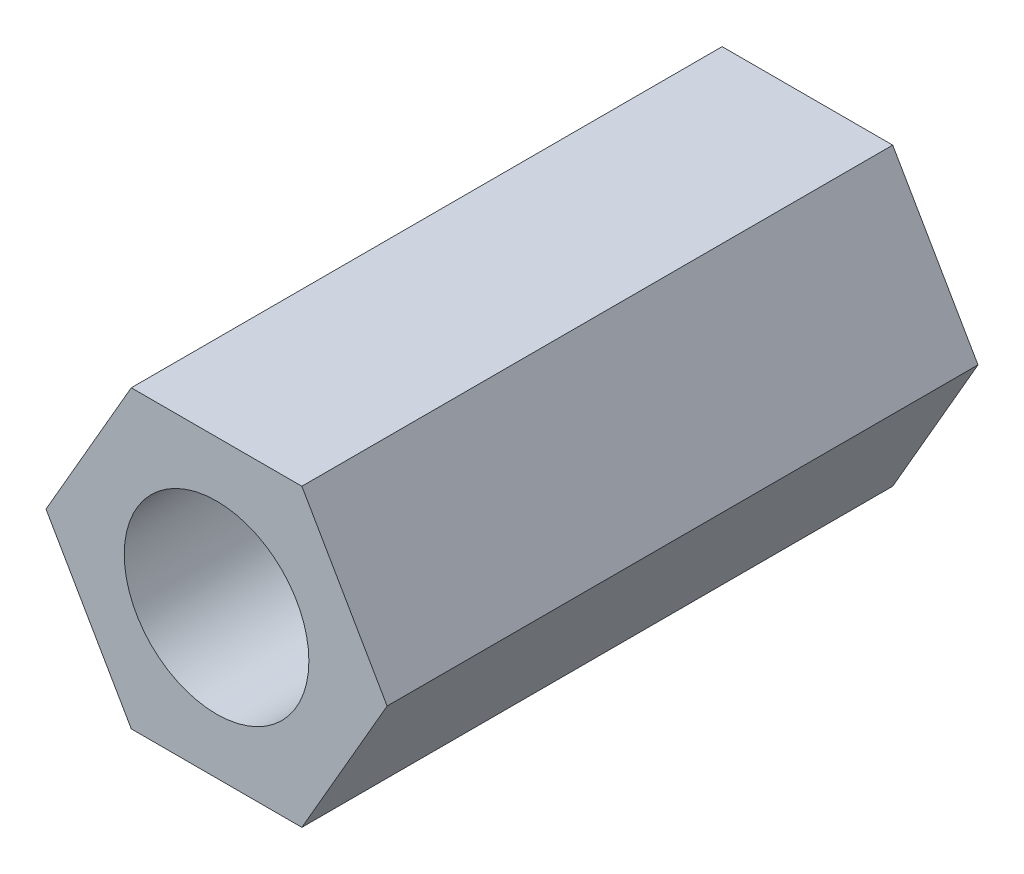
ISO-10303-21;
HEADER;
FILE_DESCRIPTION(('STEP AP214'),'2;1');
FILE_NAME('part.step','',(''),(''),'','','');
FILE_SCHEMA(('AUTOMOTIVE_DESIGN { 1 0 10303 214 1 1 1 1 }'));
ENDSEC;
DATA;
#1=APPLICATION_CONTEXT('core data for automotive mechanical design processes');
#2=APPLICATION_PROTOCOL_DEFINITION('international standard','automotive_design',2000,#1);
#3=PRODUCT_CONTEXT('',#1,'mechanical');
#4=PRODUCT('Part','Part','',(#3));
#5=PRODUCT_RELATED_PRODUCT_CATEGORY('part','',(#4));
#6=PRODUCT_DEFINITION_FORMATION('','',#4);
#7=PRODUCT_DEFINITION_CONTEXT('part definition',#1,'design');
#8=PRODUCT_DEFINITION('design','',#6,#7);
#9=PRODUCT_DEFINITION_SHAPE('','',#8);
#10=(LENGTH_UNIT() NAMED_UNIT(*) SI_UNIT(.MILLI.,.METRE.));
#11=(NAMED_UNIT(*) PLANE_ANGLE_UNIT() SI_UNIT($,.RADIAN.));
#12=(NAMED_UNIT(*) SI_UNIT($,.STERADIAN.) SOLID_ANGLE_UNIT());
#13=UNCERTAINTY_MEASURE_WITH_UNIT(LENGTH_MEASURE(1.E-05),#10,'distance_accuracy_value','');
#14=(GEOMETRIC_REPRESENTATION_CONTEXT(3) GLOBAL_UNCERTAINTY_ASSIGNED_CONTEXT((#13)) GLOBAL_UNIT_ASSIGNED_CONTEXT((#10,
#11,#12)) REPRESENTATION_CONTEXT('',''));
#15=CARTESIAN_POINT('',(0.,0.,0.));
#16=DIRECTION('',(0.,0.,1.));
#17=DIRECTION('',(1.,0.,0.));
#18=AXIS2_PLACEMENT_3D('',#15,#16,#17);
#19=CARTESIAN_POINT('',(1.15470053837927,-1.99999999999999,-8.));
#20=DIRECTION('',(0.866025403784441,-0.499999999999995,0.));
#21=DIRECTION('',(0.499999999999995,0.866025403784442,0.));
#22=AXIS2_PLACEMENT_3D('',#19,#20,#21);
#23=PLANE('',#22);
#24=DIRECTION('',(0.499999999999995,0.866025403784441,0.));
#25=VECTOR('',#24,1.);
#26=CARTESIAN_POINT('',(1.15470053837927,-1.99999999999999,0.));
#27=LINE('',#26,#25);
#28=CARTESIAN_POINT('',(1.15470053837927,-1.99999999999999,0.));
#29=VERTEX_POINT('',#28);
#30=CARTESIAN_POINT('',(2.3094010767585,0.,0.));
#31=VERTEX_POINT('',#30);
#32=EDGE_CURVE('E130',#29,#31,#27,.T.);
#33=ORIENTED_EDGE('',*,*,#32,.F.);
#34=DIRECTION('',(0.,0.,1.));
#35=VECTOR('',#34,1.);
#36=CARTESIAN_POINT('',(1.15470053837927,-1.99999999999999,-8.));
#37=LINE('',#36,#35);
#38=CARTESIAN_POINT('',(1.15470053837927,-1.99999999999999,-8.));
#39=VERTEX_POINT('',#38);
#40=EDGE_CURVE('E11',#39,#29,#37,.T.);
#41=ORIENTED_EDGE('',*,*,#40,.F.);
#42=DIRECTION('',(0.499999999999995,0.866025403784441,0.));
#43=VECTOR('',#42,1.);
#44=CARTESIAN_POINT('',(1.15470053837927,-1.99999999999999,-8.));
#45=LINE('',#44,#43);
#46=CARTESIAN_POINT('',(2.3094010767585,0.,-8.));
#47=VERTEX_POINT('',#46);
#48=EDGE_CURVE('E142',#39,#47,#45,.T.);
#49=ORIENTED_EDGE('',*,*,#48,.T.);
#50=DIRECTION('',(0.,0.,1.));
#51=VECTOR('',#50,1.);
#52=CARTESIAN_POINT('',(2.3094010767585,0.,-8.));
#53=LINE('',#52,#51);
#54=EDGE_CURVE('E93',#47,#31,#53,.T.);
#55=ORIENTED_EDGE('',*,*,#54,.T.);
#56=EDGE_LOOP('',(#33,#41,#49,#55));
#57=FACE_BOUND('',#56,.T.);
#58=ADVANCED_FACE('F39',(#57),#23,.T.);
#59=CARTESIAN_POINT('',(-1.15470053837923,-2.00000000000001,-8.));
#60=DIRECTION('',(0.,-1.,0.));
#61=DIRECTION('',(1.,0.,0.));
#62=AXIS2_PLACEMENT_3D('',#59,#60,#61);
#63=PLANE('',#62);
#64=DIRECTION('',(1.,0.,0.));
#65=VECTOR('',#64,1.);
#66=CARTESIAN_POINT('',(-1.15470053837923,-2.00000000000001,0.));
#67=LINE('',#66,#65);
#68=CARTESIAN_POINT('',(-1.15470053837923,-2.00000000000001,0.));
#69=VERTEX_POINT('',#68);
#70=EDGE_CURVE('E139',#69,#29,#67,.T.);
#71=ORIENTED_EDGE('',*,*,#70,.F.);
#72=DIRECTION('',(0.,0.,1.));
#73=VECTOR('',#72,1.);
#74=CARTESIAN_POINT('',(-1.15470053837923,-2.00000000000001,-8.));
#75=LINE('',#74,#73);
#76=CARTESIAN_POINT('',(-1.15470053837923,-2.00000000000001,-8.));
#77=VERTEX_POINT('',#76);
#78=EDGE_CURVE('E49',#77,#69,#75,.T.);
#79=ORIENTED_EDGE('',*,*,#78,.F.);
#80=DIRECTION('',(1.,0.,0.));
#81=VECTOR('',#80,1.);
#82=CARTESIAN_POINT('',(-1.15470053837923,-2.00000000000001,-8.));
#83=LINE('',#82,#81);
#84=EDGE_CURVE('E116',#77,#39,#83,.T.);
#85=ORIENTED_EDGE('',*,*,#84,.T.);
#86=ORIENTED_EDGE('',*,*,#40,.T.);
#87=EDGE_LOOP('',(#71,#79,#85,#86));
#88=FACE_BOUND('',#87,.T.);
#89=ADVANCED_FACE('F178',(#88),#63,.T.);
#90=CARTESIAN_POINT('',(-2.3094010767585,0.,-8.));
#91=DIRECTION('',(-0.866025403784435,-0.500000000000007,0.));
#92=DIRECTION('',(0.500000000000007,-0.866025403784435,0.));
#93=AXIS2_PLACEMENT_3D('',#90,#91,#92);
#94=PLANE('',#93);
#95=DIRECTION('',(0.500000000000007,-0.866025403784435,0.));
#96=VECTOR('',#95,1.);
#97=CARTESIAN_POINT('',(-2.3094010767585,0.,0.));
#98=LINE('',#97,#96);
#99=CARTESIAN_POINT('',(-2.3094010767585,0.,0.));
#100=VERTEX_POINT('',#99);
#101=EDGE_CURVE('E102',#100,#69,#98,.T.);
#102=ORIENTED_EDGE('',*,*,#101,.F.);
#103=DIRECTION('',(0.,0.,1.));
#104=VECTOR('',#103,1.);
#105=CARTESIAN_POINT('',(-2.3094010767585,0.,-8.));
#106=LINE('',#105,#104);
#107=CARTESIAN_POINT('',(-2.3094010767585,0.,-8.));
#108=VERTEX_POINT('',#107);
#109=EDGE_CURVE('E97',#108,#100,#106,.T.);
#110=ORIENTED_EDGE('',*,*,#109,.F.);
#111=DIRECTION('',(0.500000000000007,-0.866025403784435,0.));
#112=VECTOR('',#111,1.);
#113=CARTESIAN_POINT('',(-2.3094010767585,0.,-8.));
#114=LINE('',#113,#112);
#115=EDGE_CURVE('E105',#108,#77,#114,.T.);
#116=ORIENTED_EDGE('',*,*,#115,.T.);
#117=ORIENTED_EDGE('',*,*,#78,.T.);
#118=EDGE_LOOP('',(#102,#110,#116,#117));
#119=FACE_BOUND('',#118,.T.);
#120=ADVANCED_FACE('F101',(#119),#94,.T.);
#121=CARTESIAN_POINT('',(-1.15470053837926,1.99999999999999,-8.));
#122=DIRECTION('',(-0.866025403784441,0.499999999999995,0.));
#123=DIRECTION('',(-0.499999999999995,-0.866025403784442,0.));
#124=AXIS2_PLACEMENT_3D('',#121,#122,#123);
#125=PLANE('',#124);
#126=DIRECTION('',(-0.499999999999995,-0.866025403784441,0.));
#127=VECTOR('',#126,1.);
#128=CARTESIAN_POINT('',(-1.15470053837926,1.99999999999999,0.));
#129=LINE('',#128,#127);
#130=CARTESIAN_POINT('',(-1.15470053837926,1.99999999999999,0.));
#131=VERTEX_POINT('',#130);
#132=EDGE_CURVE('E140',#131,#100,#129,.T.);
#133=ORIENTED_EDGE('',*,*,#132,.F.);
#134=DIRECTION('',(0.,0.,1.));
#135=VECTOR('',#134,1.);
#136=CARTESIAN_POINT('',(-1.15470053837926,1.99999999999999,-8.));
#137=LINE('',#136,#135);
#138=CARTESIAN_POINT('',(-1.15470053837926,1.99999999999999,-8.));
#139=VERTEX_POINT('',#138);
#140=EDGE_CURVE('E108',#139,#131,#137,.T.);
#141=ORIENTED_EDGE('',*,*,#140,.F.);
#142=DIRECTION('',(-0.499999999999995,-0.866025403784441,0.));
#143=VECTOR('',#142,1.);
#144=CARTESIAN_POINT('',(-1.15470053837926,1.99999999999999,-8.));
#145=LINE('',#144,#143);
#146=EDGE_CURVE('E113',#139,#108,#145,.T.);
#147=ORIENTED_EDGE('',*,*,#146,.T.);
#148=ORIENTED_EDGE('',*,*,#109,.T.);
#149=EDGE_LOOP('',(#133,#141,#147,#148));
#150=FACE_BOUND('',#149,.T.);
#151=ADVANCED_FACE('F118',(#150),#125,.T.);
#152=CARTESIAN_POINT('',(1.15470053837925,2.,-8.));
#153=DIRECTION('',(0.,1.,0.));
#154=DIRECTION('',(-1.,0.,0.));
#155=AXIS2_PLACEMENT_3D('',#152,#153,#154);
#156=PLANE('',#155);
#157=DIRECTION('',(-1.,0.,0.));
#158=VECTOR('',#157,1.);
#159=CARTESIAN_POINT('',(1.15470053837925,2.,0.));
#160=LINE('',#159,#158);
#161=CARTESIAN_POINT('',(1.15470053837925,2.,0.));
#162=VERTEX_POINT('',#161);
#163=EDGE_CURVE('E133',#162,#131,#160,.T.);
#164=ORIENTED_EDGE('',*,*,#163,.F.);
#165=DIRECTION('',(0.,0.,1.));
#166=VECTOR('',#165,1.);
#167=CARTESIAN_POINT('',(1.15470053837925,2.,-8.));
#168=LINE('',#167,#166);
#169=CARTESIAN_POINT('',(1.15470053837925,2.,-8.));
#170=VERTEX_POINT('',#169);
#171=EDGE_CURVE('E148',#170,#162,#168,.T.);
#172=ORIENTED_EDGE('',*,*,#171,.F.);
#173=DIRECTION('',(-1.,0.,0.));
#174=VECTOR('',#173,1.);
#175=CARTESIAN_POINT('',(1.15470053837925,2.,-8.));
#176=LINE('',#175,#174);
#177=EDGE_CURVE('E117',#170,#139,#176,.T.);
#178=ORIENTED_EDGE('',*,*,#177,.T.);
#179=ORIENTED_EDGE('',*,*,#140,.T.);
#180=EDGE_LOOP('',(#164,#172,#178,#179));
#181=FACE_BOUND('',#180,.T.);
#182=ADVANCED_FACE('F189',(#181),#156,.T.);
#183=CARTESIAN_POINT('',(2.3094010767585,0.,-8.));
#184=DIRECTION('',(0.866025403784438,0.500000000000001,0.));
#185=DIRECTION('',(-0.500000000000001,0.866025403784438,0.));
#186=AXIS2_PLACEMENT_3D('',#183,#184,#185);
#187=PLANE('',#186);
#188=DIRECTION('',(-0.500000000000001,0.866025403784438,0.));
#189=VECTOR('',#188,1.);
#190=CARTESIAN_POINT('',(2.3094010767585,0.,0.));
#191=LINE('',#190,#189);
#192=EDGE_CURVE('E128',#31,#162,#191,.T.);
#193=ORIENTED_EDGE('',*,*,#192,.F.);
#194=ORIENTED_EDGE('',*,*,#54,.F.);
#195=DIRECTION('',(-0.500000000000001,0.866025403784438,0.));
#196=VECTOR('',#195,1.);
#197=CARTESIAN_POINT('',(2.3094010767585,0.,-8.));
#198=LINE('',#197,#196);
#199=EDGE_CURVE('E125',#47,#170,#198,.T.);
#200=ORIENTED_EDGE('',*,*,#199,.T.);
#201=ORIENTED_EDGE('',*,*,#171,.T.);
#202=EDGE_LOOP('',(#193,#194,#200,#201));
#203=FACE_BOUND('',#202,.T.);
#204=ADVANCED_FACE('F172',(#203),#187,.T.);
#205=CARTESIAN_POINT('',(0.,0.,-8.));
#206=DIRECTION('',(0.,0.,1.));
#207=DIRECTION('',(1.,0.,0.));
#208=AXIS2_PLACEMENT_3D('',#205,#206,#207);
#209=PLANE('',#208);
#210=CARTESIAN_POINT('',(0.,0.,-8.));
#211=DIRECTION('',(0.,0.,1.));
#212=DIRECTION('',(1.,0.,0.));
#213=AXIS2_PLACEMENT_3D('',#210,#211,#212);
#214=CIRCLE('',#213,1.25);
#215=CARTESIAN_POINT('',(1.25,0.,-8.));
#216=VERTEX_POINT('',#215);
#217=EDGE_CURVE('E154',#216,#216,#214,.T.);
#218=ORIENTED_EDGE('',*,*,#217,.T.);
#219=EDGE_LOOP('',(#218));
#220=FACE_BOUND('',#219,.T.);
#221=ORIENTED_EDGE('',*,*,#48,.F.);
#222=ORIENTED_EDGE('',*,*,#84,.F.);
#223=ORIENTED_EDGE('',*,*,#115,.F.);
#224=ORIENTED_EDGE('',*,*,#146,.F.);
#225=ORIENTED_EDGE('',*,*,#177,.F.);
#226=ORIENTED_EDGE('',*,*,#199,.F.);
#227=EDGE_LOOP('',(#221,#222,#223,#224,#225,#226));
#228=FACE_BOUND('',#227,.T.);
#229=ADVANCED_FACE('F114',(#220,#228),#209,.F.);
#230=CARTESIAN_POINT('',(0.,0.,0.));
#231=DIRECTION('',(0.,0.,1.));
#232=DIRECTION('',(1.,0.,0.));
#233=AXIS2_PLACEMENT_3D('',#230,#231,#232);
#234=PLANE('',#233);
#235=CARTESIAN_POINT('',(0.,0.,1.2E-05));
#236=DIRECTION('',(0.,0.,1.));
#237=DIRECTION('',(1.,0.,0.));
#238=AXIS2_PLACEMENT_3D('',#235,#236,#237);
#239=CIRCLE('',#238,1.25);
#240=CARTESIAN_POINT('',(1.25,0.,1.2E-05));
#241=VERTEX_POINT('',#240);
#242=EDGE_CURVE('E134',#241,#241,#239,.T.);
#243=ORIENTED_EDGE('',*,*,#242,.F.);
#244=EDGE_LOOP('',(#243));
#245=FACE_BOUND('',#244,.T.);
#246=ORIENTED_EDGE('',*,*,#32,.T.);
#247=ORIENTED_EDGE('',*,*,#192,.T.);
#248=ORIENTED_EDGE('',*,*,#163,.T.);
#249=ORIENTED_EDGE('',*,*,#132,.T.);
#250=ORIENTED_EDGE('',*,*,#101,.T.);
#251=ORIENTED_EDGE('',*,*,#70,.T.);
#252=EDGE_LOOP('',(#246,#247,#248,#249,#250,#251));
#253=FACE_BOUND('',#252,.T.);
#254=ADVANCED_FACE('F151',(#245,#253),#234,.T.);
#255=CARTESIAN_POINT('',(0.,0.,1.2E-05));
#256=DIRECTION('',(0.,0.,-1.));
#257=DIRECTION('',(-1.,0.,0.));
#258=AXIS2_PLACEMENT_3D('',#255,#256,#257);
#259=CYLINDRICAL_SURFACE('',#258,1.25);
#260=ORIENTED_EDGE('',*,*,#242,.T.);
#261=EDGE_LOOP('',(#260));
#262=FACE_BOUND('',#261,.T.);
#263=ORIENTED_EDGE('',*,*,#217,.F.);
#264=EDGE_LOOP('',(#263));
#265=FACE_BOUND('',#264,.T.);
#266=ADVANCED_FACE('F164',(#262,#265),#259,.F.);
#267=CLOSED_SHELL('',(#58,#89,#120,#151,#182,#204,#229,#254,#266));
#268=MANIFOLD_SOLID_BREP('B2',#267);
#269=ADVANCED_BREP_SHAPE_REPRESENTATION('',(#18,#268),#14);
#270=SHAPE_DEFINITION_REPRESENTATION(#9,#269);
ENDSEC;
END-ISO-10303-21;
